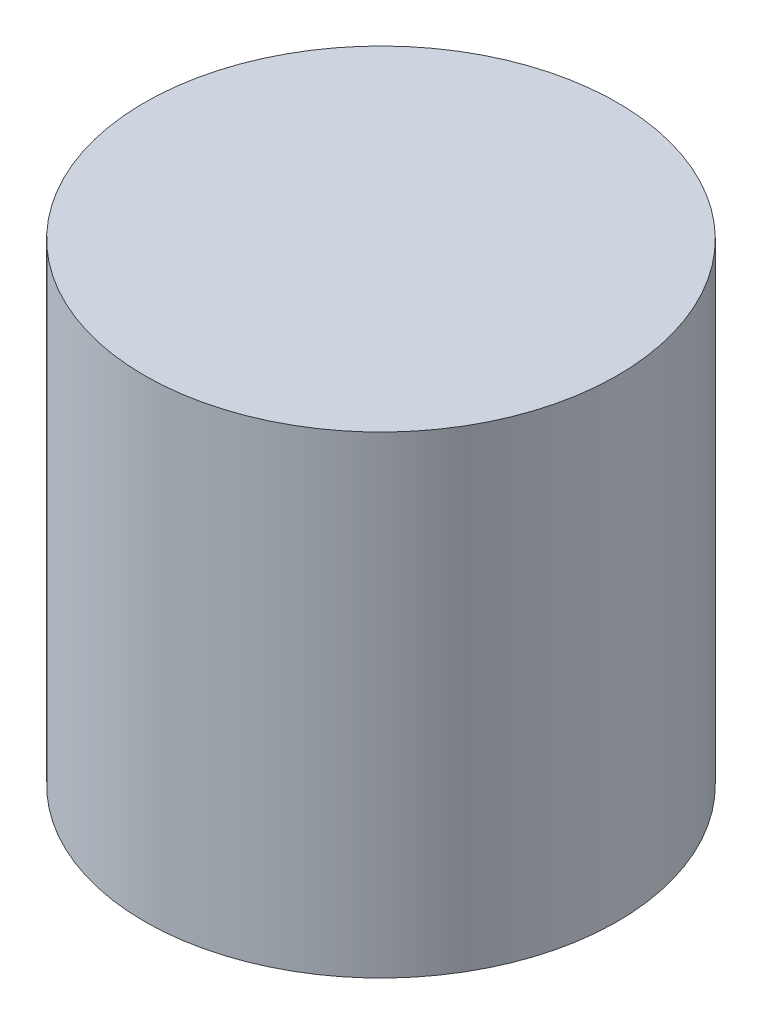
ISO-10303-21;
HEADER;
FILE_DESCRIPTION(('STEP AP214'),'2;1');
FILE_NAME('part.step','',(''),(''),'','','');
FILE_SCHEMA(('AUTOMOTIVE_DESIGN { 1 0 10303 214 1 1 1 1 }'));
ENDSEC;
DATA;
#1=APPLICATION_CONTEXT('core data for automotive mechanical design processes');
#2=APPLICATION_PROTOCOL_DEFINITION('international standard','automotive_design',2000,#1);
#3=PRODUCT_CONTEXT('',#1,'mechanical');
#4=PRODUCT('Part','Part','',(#3));
#5=PRODUCT_RELATED_PRODUCT_CATEGORY('part','',(#4));
#6=PRODUCT_DEFINITION_FORMATION('','',#4);
#7=PRODUCT_DEFINITION_CONTEXT('part definition',#1,'design');
#8=PRODUCT_DEFINITION('design','',#6,#7);
#9=PRODUCT_DEFINITION_SHAPE('','',#8);
#10=(LENGTH_UNIT() NAMED_UNIT(*) SI_UNIT(.MILLI.,.METRE.));
#11=(NAMED_UNIT(*) PLANE_ANGLE_UNIT() SI_UNIT($,.RADIAN.));
#12=(NAMED_UNIT(*) SI_UNIT($,.STERADIAN.) SOLID_ANGLE_UNIT());
#13=UNCERTAINTY_MEASURE_WITH_UNIT(LENGTH_MEASURE(1.E-05),#10,'distance_accuracy_value','');
#14=(GEOMETRIC_REPRESENTATION_CONTEXT(3) GLOBAL_UNCERTAINTY_ASSIGNED_CONTEXT((#13)) GLOBAL_UNIT_ASSIGNED_CONTEXT((#10,
#11,#12)) REPRESENTATION_CONTEXT('',''));
#15=CARTESIAN_POINT('',(0.,0.,0.));
#16=DIRECTION('',(0.,0.,1.));
#17=DIRECTION('',(1.,0.,0.));
#18=AXIS2_PLACEMENT_3D('',#15,#16,#17);
#19=CARTESIAN_POINT('',(0.,36.,0.));
#20=DIRECTION('',(0.,-1.,0.));
#21=DIRECTION('',(0.,0.,-1.));
#22=AXIS2_PLACEMENT_3D('',#19,#20,#21);
#23=CYLINDRICAL_SURFACE('',#22,18.);
#24=CARTESIAN_POINT('',(0.,36.,0.));
#25=DIRECTION('',(0.,1.,0.));
#26=DIRECTION('',(0.,0.,1.));
#27=AXIS2_PLACEMENT_3D('',#24,#25,#26);
#28=CIRCLE('',#27,18.);
#29=CARTESIAN_POINT('',(0.,36.,18.));
#30=VERTEX_POINT('',#29);
#31=EDGE_CURVE('E10',#30,#30,#28,.T.);
#32=ORIENTED_EDGE('',*,*,#31,.F.);
#33=EDGE_LOOP('',(#32));
#34=FACE_BOUND('',#33,.T.);
#35=CARTESIAN_POINT('',(0.,0.,0.));
#36=DIRECTION('',(0.,1.,0.));
#37=DIRECTION('',(0.,0.,1.));
#38=AXIS2_PLACEMENT_3D('',#35,#36,#37);
#39=CIRCLE('',#38,18.);
#40=CARTESIAN_POINT('',(0.,0.,18.));
#41=VERTEX_POINT('',#40);
#42=EDGE_CURVE('E40',#41,#41,#39,.T.);
#43=ORIENTED_EDGE('',*,*,#42,.T.);
#44=EDGE_LOOP('',(#43));
#45=FACE_BOUND('',#44,.T.);
#46=ADVANCED_FACE('F37',(#34,#45),#23,.T.);
#47=CARTESIAN_POINT('',(0.,36.,0.));
#48=DIRECTION('',(0.,1.,0.));
#49=DIRECTION('',(0.,0.,1.));
#50=AXIS2_PLACEMENT_3D('',#47,#48,#49);
#51=PLANE('',#50);
#52=ORIENTED_EDGE('',*,*,#31,.T.);
#53=EDGE_LOOP('',(#52));
#54=FACE_BOUND('',#53,.T.);
#55=ADVANCED_FACE('F54',(#54),#51,.T.);
#56=CARTESIAN_POINT('',(0.,0.,0.));
#57=DIRECTION('',(0.,1.,0.));
#58=DIRECTION('',(0.,0.,1.));
#59=AXIS2_PLACEMENT_3D('',#56,#57,#58);
#60=PLANE('',#59);
#61=ORIENTED_EDGE('',*,*,#42,.F.);
#62=EDGE_LOOP('',(#61));
#63=FACE_BOUND('',#62,.T.);
#64=ADVANCED_FACE('F52',(#63),#60,.F.);
#65=CLOSED_SHELL('',(#46,#55,#64));
#66=MANIFOLD_SOLID_BREP('B2',#65);
#67=ADVANCED_BREP_SHAPE_REPRESENTATION('',(#18,#66),#14);
#68=SHAPE_DEFINITION_REPRESENTATION(#9,#67);
ENDSEC;
END-ISO-10303-21;
